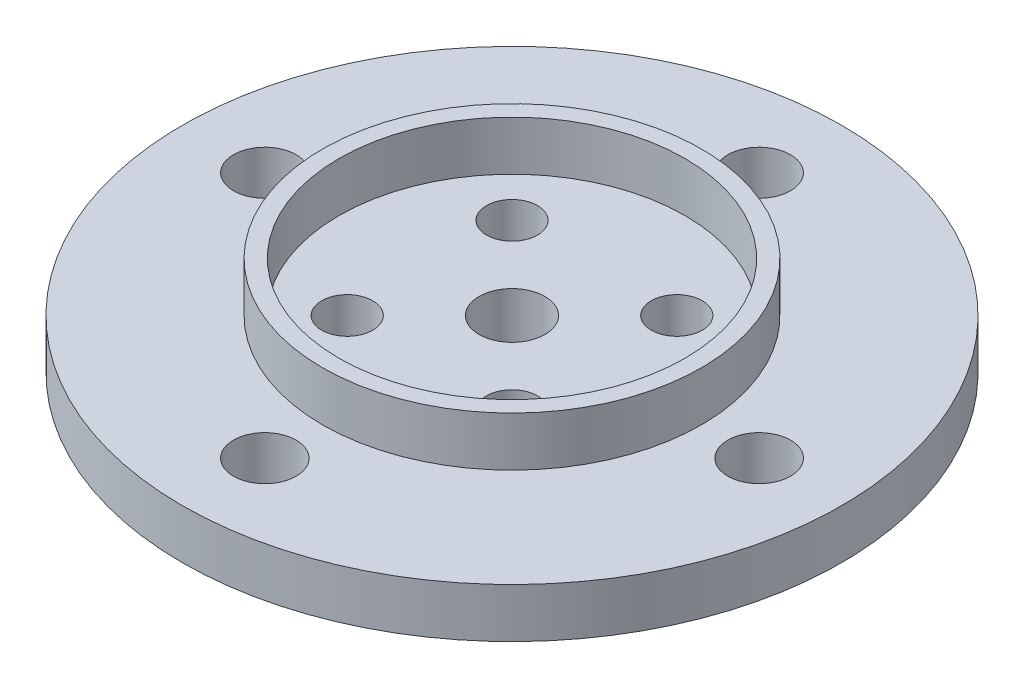
ISO-10303-21;
HEADER;
FILE_DESCRIPTION(('STEP AP214'),'2;1');
FILE_NAME('part.step','',(''),(''),'','','');
FILE_SCHEMA(('AUTOMOTIVE_DESIGN { 1 0 10303 214 1 1 1 1 }'));
ENDSEC;
DATA;
#1=APPLICATION_CONTEXT('core data for automotive mechanical design processes');
#2=APPLICATION_PROTOCOL_DEFINITION('international standard','automotive_design',2000,#1);
#3=PRODUCT_CONTEXT('',#1,'mechanical');
#4=PRODUCT('Part','Part','',(#3));
#5=PRODUCT_RELATED_PRODUCT_CATEGORY('part','',(#4));
#6=PRODUCT_DEFINITION_FORMATION('','',#4);
#7=PRODUCT_DEFINITION_CONTEXT('part definition',#1,'design');
#8=PRODUCT_DEFINITION('design','',#6,#7);
#9=PRODUCT_DEFINITION_SHAPE('','',#8);
#10=(LENGTH_UNIT() NAMED_UNIT(*) SI_UNIT(.MILLI.,.METRE.));
#11=(NAMED_UNIT(*) PLANE_ANGLE_UNIT() SI_UNIT($,.RADIAN.));
#12=(NAMED_UNIT(*) SI_UNIT($,.STERADIAN.) SOLID_ANGLE_UNIT());
#13=UNCERTAINTY_MEASURE_WITH_UNIT(LENGTH_MEASURE(1.E-05),#10,'distance_accuracy_value','');
#14=(GEOMETRIC_REPRESENTATION_CONTEXT(3) GLOBAL_UNCERTAINTY_ASSIGNED_CONTEXT((#13)) GLOBAL_UNIT_ASSIGNED_CONTEXT((#10,
#11,#12)) REPRESENTATION_CONTEXT('',''));
#15=CARTESIAN_POINT('',(0.,0.,0.));
#16=DIRECTION('',(0.,0.,1.));
#17=DIRECTION('',(1.,0.,0.));
#18=AXIS2_PLACEMENT_3D('',#15,#16,#17);
#19=CARTESIAN_POINT('',(0.,3.,0.));
#20=DIRECTION('',(0.,1.,0.));
#21=DIRECTION('',(0.,0.,1.));
#22=AXIS2_PLACEMENT_3D('',#19,#20,#21);
#23=PLANE('',#22);
#24=CARTESIAN_POINT('',(0.,3.,0.));
#25=DIRECTION('',(0.,1.,0.));
#26=DIRECTION('',(0.,0.,1.));
#27=AXIS2_PLACEMENT_3D('',#24,#25,#26);
#28=CIRCLE('',#27,2.);
#29=CARTESIAN_POINT('',(0.,3.,2.));
#30=VERTEX_POINT('',#29);
#31=EDGE_CURVE('E53',#30,#30,#28,.T.);
#32=ORIENTED_EDGE('',*,*,#31,.F.);
#33=EDGE_LOOP('',(#32));
#34=FACE_BOUND('',#33,.T.);
#35=CARTESIAN_POINT('',(4.99999999999997,3.,5.00000000000003));
#36=DIRECTION('',(0.,1.,0.));
#37=DIRECTION('',(0.,0.,1.));
#38=AXIS2_PLACEMENT_3D('',#35,#36,#37);
#39=CIRCLE('',#38,1.55);
#40=CARTESIAN_POINT('',(4.99999999999997,3.,6.55000000000003));
#41=VERTEX_POINT('',#40);
#42=EDGE_CURVE('E58',#41,#41,#39,.T.);
#43=ORIENTED_EDGE('',*,*,#42,.F.);
#44=EDGE_LOOP('',(#43));
#45=FACE_BOUND('',#44,.T.);
#46=CARTESIAN_POINT('',(-5.00000000000005,3.,4.99999999999995));
#47=DIRECTION('',(0.,1.,0.));
#48=DIRECTION('',(0.,0.,1.));
#49=AXIS2_PLACEMENT_3D('',#46,#47,#48);
#50=CIRCLE('',#49,1.55);
#51=CARTESIAN_POINT('',(-5.00000000000005,3.,6.54999999999995));
#52=VERTEX_POINT('',#51);
#53=EDGE_CURVE('E102',#52,#52,#50,.T.);
#54=ORIENTED_EDGE('',*,*,#53,.F.);
#55=EDGE_LOOP('',(#54));
#56=FACE_BOUND('',#55,.T.);
#57=CARTESIAN_POINT('',(5.00000000000002,3.,-4.99999999999998));
#58=DIRECTION('',(0.,1.,0.));
#59=DIRECTION('',(0.,0.,1.));
#60=AXIS2_PLACEMENT_3D('',#57,#58,#59);
#61=CIRCLE('',#60,1.55);
#62=CARTESIAN_POINT('',(5.00000000000002,3.,-3.44999999999998));
#63=VERTEX_POINT('',#62);
#64=EDGE_CURVE('E96',#63,#63,#61,.T.);
#65=ORIENTED_EDGE('',*,*,#64,.F.);
#66=EDGE_LOOP('',(#65));
#67=FACE_BOUND('',#66,.T.);
#68=CARTESIAN_POINT('',(-5.,3.,-5.));
#69=DIRECTION('',(0.,1.,0.));
#70=DIRECTION('',(0.,0.,1.));
#71=AXIS2_PLACEMENT_3D('',#68,#69,#70);
#72=CIRCLE('',#71,1.55);
#73=CARTESIAN_POINT('',(-5.,3.,-3.45));
#74=VERTEX_POINT('',#73);
#75=EDGE_CURVE('E91',#74,#74,#72,.T.);
#76=ORIENTED_EDGE('',*,*,#75,.F.);
#77=EDGE_LOOP('',(#76));
#78=FACE_BOUND('',#77,.T.);
#79=CARTESIAN_POINT('',(0.,3.,0.));
#80=DIRECTION('',(0.,1.,0.));
#81=DIRECTION('',(0.,0.,1.));
#82=AXIS2_PLACEMENT_3D('',#79,#80,#81);
#83=CIRCLE('',#82,10.5);
#84=CARTESIAN_POINT('',(0.,3.,10.5));
#85=VERTEX_POINT('',#84);
#86=EDGE_CURVE('E10',#85,#85,#83,.F.);
#87=ORIENTED_EDGE('',*,*,#86,.F.);
#88=EDGE_LOOP('',(#87));
#89=FACE_BOUND('',#88,.T.);
#90=ADVANCED_FACE('F45',(#34,#45,#56,#67,#78,#89),#23,.T.);
#91=CARTESIAN_POINT('',(4.99999999999997,3.,5.00000000000003));
#92=DIRECTION('',(0.,-1.,0.));
#93=DIRECTION('',(0.,0.,-1.));
#94=AXIS2_PLACEMENT_3D('',#91,#92,#93);
#95=CYLINDRICAL_SURFACE('',#94,1.55);
#96=ORIENTED_EDGE('',*,*,#42,.T.);
#97=EDGE_LOOP('',(#96));
#98=FACE_BOUND('',#97,.T.);
#99=CARTESIAN_POINT('',(4.99999999999997,0.,5.00000000000003));
#100=DIRECTION('',(0.,1.,0.));
#101=DIRECTION('',(0.,0.,1.));
#102=AXIS2_PLACEMENT_3D('',#99,#100,#101);
#103=CIRCLE('',#102,1.55);
#104=CARTESIAN_POINT('',(4.99999999999997,0.,6.55000000000003));
#105=VERTEX_POINT('',#104);
#106=EDGE_CURVE('E85',#105,#105,#103,.T.);
#107=ORIENTED_EDGE('',*,*,#106,.F.);
#108=EDGE_LOOP('',(#107));
#109=FACE_BOUND('',#108,.T.);
#110=ADVANCED_FACE('F120',(#98,#109),#95,.F.);
#111=CARTESIAN_POINT('',(0.,3.,0.));
#112=DIRECTION('',(0.,-1.,0.));
#113=DIRECTION('',(0.,0.,-1.));
#114=AXIS2_PLACEMENT_3D('',#111,#112,#113);
#115=CYLINDRICAL_SURFACE('',#114,20.);
#116=CARTESIAN_POINT('',(0.,3.,0.));
#117=DIRECTION('',(0.,1.,0.));
#118=DIRECTION('',(0.,0.,1.));
#119=AXIS2_PLACEMENT_3D('',#116,#117,#118);
#120=CIRCLE('',#119,20.);
#121=CARTESIAN_POINT('',(0.,3.,20.));
#122=VERTEX_POINT('',#121);
#123=EDGE_CURVE('E64',#122,#122,#120,.T.);
#124=ORIENTED_EDGE('',*,*,#123,.F.);
#125=EDGE_LOOP('',(#124));
#126=FACE_BOUND('',#125,.T.);
#127=CARTESIAN_POINT('',(0.,0.,0.));
#128=DIRECTION('',(0.,1.,0.));
#129=DIRECTION('',(0.,0.,1.));
#130=AXIS2_PLACEMENT_3D('',#127,#128,#129);
#131=CIRCLE('',#130,20.);
#132=CARTESIAN_POINT('',(0.,0.,20.));
#133=VERTEX_POINT('',#132);
#134=EDGE_CURVE('E81',#133,#133,#131,.T.);
#135=ORIENTED_EDGE('',*,*,#134,.T.);
#136=EDGE_LOOP('',(#135));
#137=FACE_BOUND('',#136,.T.);
#138=ADVANCED_FACE('F116',(#126,#137),#115,.T.);
#139=CARTESIAN_POINT('',(-5.00000000000005,3.,4.99999999999995));
#140=DIRECTION('',(0.,-1.,0.));
#141=DIRECTION('',(0.,0.,-1.));
#142=AXIS2_PLACEMENT_3D('',#139,#140,#141);
#143=CYLINDRICAL_SURFACE('',#142,1.55);
#144=ORIENTED_EDGE('',*,*,#53,.T.);
#145=EDGE_LOOP('',(#144));
#146=FACE_BOUND('',#145,.T.);
#147=CARTESIAN_POINT('',(-5.00000000000005,0.,4.99999999999995));
#148=DIRECTION('',(0.,1.,0.));
#149=DIRECTION('',(0.,0.,1.));
#150=AXIS2_PLACEMENT_3D('',#147,#148,#149);
#151=CIRCLE('',#150,1.55);
#152=CARTESIAN_POINT('',(-5.00000000000005,0.,6.54999999999995));
#153=VERTEX_POINT('',#152);
#154=EDGE_CURVE('E77',#153,#153,#151,.T.);
#155=ORIENTED_EDGE('',*,*,#154,.F.);
#156=EDGE_LOOP('',(#155));
#157=FACE_BOUND('',#156,.T.);
#158=ADVANCED_FACE('F119',(#146,#157),#143,.F.);
#159=CARTESIAN_POINT('',(5.00000000000002,3.,-4.99999999999998));
#160=DIRECTION('',(0.,-1.,0.));
#161=DIRECTION('',(0.,0.,-1.));
#162=AXIS2_PLACEMENT_3D('',#159,#160,#161);
#163=CYLINDRICAL_SURFACE('',#162,1.55);
#164=ORIENTED_EDGE('',*,*,#64,.T.);
#165=EDGE_LOOP('',(#164));
#166=FACE_BOUND('',#165,.T.);
#167=CARTESIAN_POINT('',(5.00000000000002,0.,-4.99999999999998));
#168=DIRECTION('',(0.,1.,0.));
#169=DIRECTION('',(0.,0.,1.));
#170=AXIS2_PLACEMENT_3D('',#167,#168,#169);
#171=CIRCLE('',#170,1.55);
#172=CARTESIAN_POINT('',(5.00000000000002,0.,-3.44999999999998));
#173=VERTEX_POINT('',#172);
#174=EDGE_CURVE('E72',#173,#173,#171,.T.);
#175=ORIENTED_EDGE('',*,*,#174,.F.);
#176=EDGE_LOOP('',(#175));
#177=FACE_BOUND('',#176,.T.);
#178=ADVANCED_FACE('F144',(#166,#177),#163,.F.);
#179=CARTESIAN_POINT('',(-5.,3.,-5.));
#180=DIRECTION('',(0.,-1.,0.));
#181=DIRECTION('',(0.,0.,-1.));
#182=AXIS2_PLACEMENT_3D('',#179,#180,#181);
#183=CYLINDRICAL_SURFACE('',#182,1.55);
#184=ORIENTED_EDGE('',*,*,#75,.T.);
#185=EDGE_LOOP('',(#184));
#186=FACE_BOUND('',#185,.T.);
#187=CARTESIAN_POINT('',(-5.,0.,-5.));
#188=DIRECTION('',(0.,1.,0.));
#189=DIRECTION('',(0.,0.,1.));
#190=AXIS2_PLACEMENT_3D('',#187,#188,#189);
#191=CIRCLE('',#190,1.55);
#192=CARTESIAN_POINT('',(-5.,0.,-3.45));
#193=VERTEX_POINT('',#192);
#194=EDGE_CURVE('E68',#193,#193,#191,.T.);
#195=ORIENTED_EDGE('',*,*,#194,.F.);
#196=EDGE_LOOP('',(#195));
#197=FACE_BOUND('',#196,.T.);
#198=ADVANCED_FACE('F47',(#186,#197),#183,.F.);
#199=CARTESIAN_POINT('',(0.,3.,0.));
#200=DIRECTION('',(0.,-1.,0.));
#201=DIRECTION('',(0.,0.,-1.));
#202=AXIS2_PLACEMENT_3D('',#199,#200,#201);
#203=CYLINDRICAL_SURFACE('',#202,2.);
#204=ORIENTED_EDGE('',*,*,#31,.T.);
#205=EDGE_LOOP('',(#204));
#206=FACE_BOUND('',#205,.T.);
#207=CARTESIAN_POINT('',(0.,0.,0.));
#208=DIRECTION('',(0.,1.,0.));
#209=DIRECTION('',(0.,0.,1.));
#210=AXIS2_PLACEMENT_3D('',#207,#208,#209);
#211=CIRCLE('',#210,2.);
#212=CARTESIAN_POINT('',(0.,0.,2.));
#213=VERTEX_POINT('',#212);
#214=EDGE_CURVE('E88',#213,#213,#211,.T.);
#215=ORIENTED_EDGE('',*,*,#214,.F.);
#216=EDGE_LOOP('',(#215));
#217=FACE_BOUND('',#216,.T.);
#218=ADVANCED_FACE('F141',(#206,#217),#203,.F.);
#219=CARTESIAN_POINT('',(-1.04744440165294E-13,3.,15.));
#220=DIRECTION('',(0.,-1.,0.));
#221=DIRECTION('',(0.,0.,-1.));
#222=AXIS2_PLACEMENT_3D('',#219,#220,#221);
#223=CIRCLE('',#222,1.9);
#224=CARTESIAN_POINT('',(-1.04744440165294E-13,3.,13.1));
#225=VERTEX_POINT('',#224);
#226=EDGE_CURVE('E207',#225,#225,#223,.T.);
#227=ORIENTED_EDGE('',*,*,#226,.T.);
#228=EDGE_LOOP('',(#227));
#229=FACE_BOUND('',#228,.T.);
#230=CARTESIAN_POINT('',(15.,3.,0.));
#231=DIRECTION('',(0.,-1.,0.));
#232=DIRECTION('',(0.,0.,-1.));
#233=AXIS2_PLACEMENT_3D('',#230,#231,#232);
#234=CIRCLE('',#233,1.9);
#235=CARTESIAN_POINT('',(15.,3.,-1.89999999999995));
#236=VERTEX_POINT('',#235);
#237=EDGE_CURVE('E219',#236,#236,#234,.T.);
#238=ORIENTED_EDGE('',*,*,#237,.T.);
#239=EDGE_LOOP('',(#238));
#240=FACE_BOUND('',#239,.T.);
#241=CARTESIAN_POINT('',(0.,3.,-15.));
#242=DIRECTION('',(0.,-1.,0.));
#243=DIRECTION('',(0.,0.,-1.));
#244=AXIS2_PLACEMENT_3D('',#241,#242,#243);
#245=CIRCLE('',#244,1.9);
#246=CARTESIAN_POINT('',(0.,3.,-16.9));
#247=VERTEX_POINT('',#246);
#248=EDGE_CURVE('E229',#247,#247,#245,.T.);
#249=ORIENTED_EDGE('',*,*,#248,.T.);
#250=EDGE_LOOP('',(#249));
#251=FACE_BOUND('',#250,.T.);
#252=CARTESIAN_POINT('',(-15.,3.,0.));
#253=DIRECTION('',(0.,-1.,0.));
#254=DIRECTION('',(0.,0.,-1.));
#255=AXIS2_PLACEMENT_3D('',#252,#253,#254);
#256=CIRCLE('',#255,1.9);
#257=CARTESIAN_POINT('',(-15.,3.,-1.89999999999995));
#258=VERTEX_POINT('',#257);
#259=EDGE_CURVE('E237',#258,#258,#256,.T.);
#260=ORIENTED_EDGE('',*,*,#259,.T.);
#261=EDGE_LOOP('',(#260));
#262=FACE_BOUND('',#261,.T.);
#263=CARTESIAN_POINT('',(0.,3.,0.));
#264=DIRECTION('',(0.,1.,0.));
#265=DIRECTION('',(0.,0.,1.));
#266=AXIS2_PLACEMENT_3D('',#263,#264,#265);
#267=CIRCLE('',#266,11.5);
#268=CARTESIAN_POINT('',(0.,3.,11.5));
#269=VERTEX_POINT('',#268);
#270=EDGE_CURVE('E105',#269,#269,#267,.T.);
#271=ORIENTED_EDGE('',*,*,#270,.F.);
#272=EDGE_LOOP('',(#271));
#273=FACE_BOUND('',#272,.T.);
#274=ORIENTED_EDGE('',*,*,#123,.T.);
#275=EDGE_LOOP('',(#274));
#276=FACE_BOUND('',#275,.T.);
#277=ADVANCED_FACE('F114',(#229,#240,#251,#262,#273,#276),#23,.T.);
#278=CARTESIAN_POINT('',(0.,0.,0.));
#279=DIRECTION('',(0.,1.,0.));
#280=DIRECTION('',(0.,0.,1.));
#281=AXIS2_PLACEMENT_3D('',#278,#279,#280);
#282=PLANE('',#281);
#283=CARTESIAN_POINT('',(-1.04744440165294E-13,0.,15.));
#284=DIRECTION('',(0.,-1.,0.));
#285=DIRECTION('',(0.,0.,-1.));
#286=AXIS2_PLACEMENT_3D('',#283,#284,#285);
#287=CIRCLE('',#286,1.9);
#288=CARTESIAN_POINT('',(-1.04744440165294E-13,0.,13.1));
#289=VERTEX_POINT('',#288);
#290=EDGE_CURVE('E210',#289,#289,#287,.T.);
#291=ORIENTED_EDGE('',*,*,#290,.F.);
#292=EDGE_LOOP('',(#291));
#293=FACE_BOUND('',#292,.T.);
#294=CARTESIAN_POINT('',(15.,0.,0.));
#295=DIRECTION('',(0.,-1.,0.));
#296=DIRECTION('',(0.,0.,-1.));
#297=AXIS2_PLACEMENT_3D('',#294,#295,#296);
#298=CIRCLE('',#297,1.9);
#299=CARTESIAN_POINT('',(15.,0.,-1.89999999999995));
#300=VERTEX_POINT('',#299);
#301=EDGE_CURVE('E212',#300,#300,#298,.T.);
#302=ORIENTED_EDGE('',*,*,#301,.F.);
#303=EDGE_LOOP('',(#302));
#304=FACE_BOUND('',#303,.T.);
#305=CARTESIAN_POINT('',(0.,0.,-15.));
#306=DIRECTION('',(0.,-1.,0.));
#307=DIRECTION('',(0.,0.,-1.));
#308=AXIS2_PLACEMENT_3D('',#305,#306,#307);
#309=CIRCLE('',#308,1.9);
#310=CARTESIAN_POINT('',(0.,0.,-16.9));
#311=VERTEX_POINT('',#310);
#312=EDGE_CURVE('E225',#311,#311,#309,.T.);
#313=ORIENTED_EDGE('',*,*,#312,.F.);
#314=EDGE_LOOP('',(#313));
#315=FACE_BOUND('',#314,.T.);
#316=CARTESIAN_POINT('',(-15.,0.,0.));
#317=DIRECTION('',(0.,-1.,0.));
#318=DIRECTION('',(0.,0.,-1.));
#319=AXIS2_PLACEMENT_3D('',#316,#317,#318);
#320=CIRCLE('',#319,1.9);
#321=CARTESIAN_POINT('',(-15.,0.,-1.89999999999995));
#322=VERTEX_POINT('',#321);
#323=EDGE_CURVE('E233',#322,#322,#320,.T.);
#324=ORIENTED_EDGE('',*,*,#323,.F.);
#325=EDGE_LOOP('',(#324));
#326=FACE_BOUND('',#325,.T.);
#327=ORIENTED_EDGE('',*,*,#194,.T.);
#328=EDGE_LOOP('',(#327));
#329=FACE_BOUND('',#328,.T.);
#330=ORIENTED_EDGE('',*,*,#174,.T.);
#331=EDGE_LOOP('',(#330));
#332=FACE_BOUND('',#331,.T.);
#333=ORIENTED_EDGE('',*,*,#154,.T.);
#334=EDGE_LOOP('',(#333));
#335=FACE_BOUND('',#334,.T.);
#336=ORIENTED_EDGE('',*,*,#134,.F.);
#337=EDGE_LOOP('',(#336));
#338=FACE_BOUND('',#337,.T.);
#339=ORIENTED_EDGE('',*,*,#106,.T.);
#340=EDGE_LOOP('',(#339));
#341=FACE_BOUND('',#340,.T.);
#342=ORIENTED_EDGE('',*,*,#214,.T.);
#343=EDGE_LOOP('',(#342));
#344=FACE_BOUND('',#343,.T.);
#345=ADVANCED_FACE('F124',(#293,#304,#315,#326,#329,#332,#335,#338,#341,#344),#282,.F.);
#346=CARTESIAN_POINT('',(0.,6.,0.));
#347=DIRECTION('',(0.,1.,0.));
#348=DIRECTION('',(0.,0.,1.));
#349=AXIS2_PLACEMENT_3D('',#346,#347,#348);
#350=PLANE('',#349);
#351=CARTESIAN_POINT('',(0.,6.,0.));
#352=DIRECTION('',(0.,1.,0.));
#353=DIRECTION('',(0.,0.,1.));
#354=AXIS2_PLACEMENT_3D('',#351,#352,#353);
#355=CIRCLE('',#354,11.5);
#356=CARTESIAN_POINT('',(0.,6.,11.5));
#357=VERTEX_POINT('',#356);
#358=EDGE_CURVE('E73',#357,#357,#355,.T.);
#359=ORIENTED_EDGE('',*,*,#358,.T.);
#360=EDGE_LOOP('',(#359));
#361=FACE_BOUND('',#360,.T.);
#362=CARTESIAN_POINT('',(0.,6.,0.));
#363=DIRECTION('',(0.,1.,0.));
#364=DIRECTION('',(0.,0.,1.));
#365=AXIS2_PLACEMENT_3D('',#362,#363,#364);
#366=CIRCLE('',#365,10.5);
#367=CARTESIAN_POINT('',(0.,6.,10.5));
#368=VERTEX_POINT('',#367);
#369=EDGE_CURVE('E216',#368,#368,#366,.T.);
#370=ORIENTED_EDGE('',*,*,#369,.F.);
#371=EDGE_LOOP('',(#370));
#372=FACE_BOUND('',#371,.T.);
#373=ADVANCED_FACE('F127',(#361,#372),#350,.T.);
#374=CARTESIAN_POINT('',(0.,6.,0.));
#375=DIRECTION('',(0.,-1.,0.));
#376=DIRECTION('',(0.,0.,-1.));
#377=AXIS2_PLACEMENT_3D('',#374,#375,#376);
#378=CYLINDRICAL_SURFACE('',#377,11.5);
#379=ORIENTED_EDGE('',*,*,#358,.F.);
#380=EDGE_LOOP('',(#379));
#381=FACE_BOUND('',#380,.T.);
#382=ORIENTED_EDGE('',*,*,#270,.T.);
#383=EDGE_LOOP('',(#382));
#384=FACE_BOUND('',#383,.T.);
#385=ADVANCED_FACE('F178',(#381,#384),#378,.T.);
#386=CARTESIAN_POINT('',(0.,6.,0.));
#387=DIRECTION('',(0.,-1.,0.));
#388=DIRECTION('',(0.,0.,-1.));
#389=AXIS2_PLACEMENT_3D('',#386,#387,#388);
#390=CYLINDRICAL_SURFACE('',#389,10.5);
#391=ORIENTED_EDGE('',*,*,#369,.T.);
#392=EDGE_LOOP('',(#391));
#393=FACE_BOUND('',#392,.T.);
#394=ORIENTED_EDGE('',*,*,#86,.T.);
#395=EDGE_LOOP('',(#394));
#396=FACE_BOUND('',#395,.T.);
#397=ADVANCED_FACE('F181',(#393,#396),#390,.F.);
#398=CARTESIAN_POINT('',(-15.,3.,0.));
#399=DIRECTION('',(0.,-1.,0.));
#400=DIRECTION('',(0.,0.,-1.));
#401=AXIS2_PLACEMENT_3D('',#398,#399,#400);
#402=CYLINDRICAL_SURFACE('',#401,1.9);
#403=ORIENTED_EDGE('',*,*,#259,.F.);
#404=EDGE_LOOP('',(#403));
#405=FACE_BOUND('',#404,.T.);
#406=ORIENTED_EDGE('',*,*,#323,.T.);
#407=EDGE_LOOP('',(#406));
#408=FACE_BOUND('',#407,.T.);
#409=ADVANCED_FACE('F187',(#405,#408),#402,.F.);
#410=CARTESIAN_POINT('',(0.,3.,-15.));
#411=DIRECTION('',(0.,-1.,0.));
#412=DIRECTION('',(0.,0.,-1.));
#413=AXIS2_PLACEMENT_3D('',#410,#411,#412);
#414=CYLINDRICAL_SURFACE('',#413,1.9);
#415=ORIENTED_EDGE('',*,*,#248,.F.);
#416=EDGE_LOOP('',(#415));
#417=FACE_BOUND('',#416,.T.);
#418=ORIENTED_EDGE('',*,*,#312,.T.);
#419=EDGE_LOOP('',(#418));
#420=FACE_BOUND('',#419,.T.);
#421=ADVANCED_FACE('F191',(#417,#420),#414,.F.);
#422=CARTESIAN_POINT('',(15.,3.,0.));
#423=DIRECTION('',(0.,-1.,0.));
#424=DIRECTION('',(0.,0.,-1.));
#425=AXIS2_PLACEMENT_3D('',#422,#423,#424);
#426=CYLINDRICAL_SURFACE('',#425,1.9);
#427=ORIENTED_EDGE('',*,*,#237,.F.);
#428=EDGE_LOOP('',(#427));
#429=FACE_BOUND('',#428,.T.);
#430=ORIENTED_EDGE('',*,*,#301,.T.);
#431=EDGE_LOOP('',(#430));
#432=FACE_BOUND('',#431,.T.);
#433=ADVANCED_FACE('F195',(#429,#432),#426,.F.);
#434=CARTESIAN_POINT('',(-1.04744440165294E-13,3.,15.));
#435=DIRECTION('',(0.,-1.,0.));
#436=DIRECTION('',(0.,0.,-1.));
#437=AXIS2_PLACEMENT_3D('',#434,#435,#436);
#438=CYLINDRICAL_SURFACE('',#437,1.9);
#439=ORIENTED_EDGE('',*,*,#226,.F.);
#440=EDGE_LOOP('',(#439));
#441=FACE_BOUND('',#440,.T.);
#442=ORIENTED_EDGE('',*,*,#290,.T.);
#443=EDGE_LOOP('',(#442));
#444=FACE_BOUND('',#443,.T.);
#445=ADVANCED_FACE('F199',(#441,#444),#438,.F.);
#446=CLOSED_SHELL('',(#90,#110,#138,#158,#178,#198,#218,#277,#345,#373,#385,#397,#409,#421,#433,#445));
#447=MANIFOLD_SOLID_BREP('B2',#446);
#448=ADVANCED_BREP_SHAPE_REPRESENTATION('',(#18,#447),#14);
#449=SHAPE_DEFINITION_REPRESENTATION(#9,#448);
ENDSEC;
END-ISO-10303-21;
